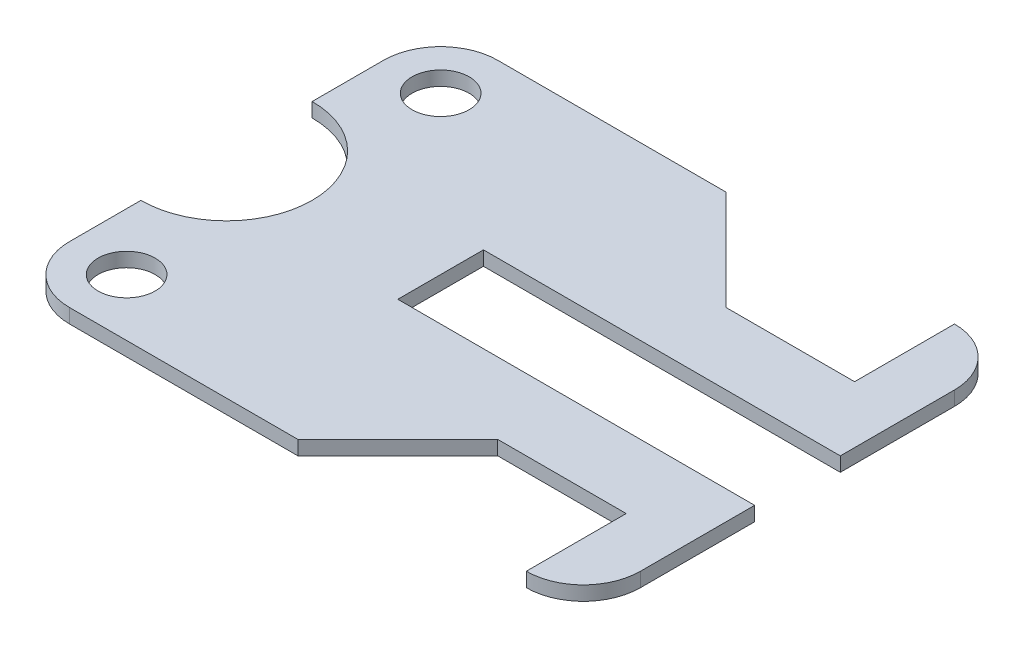
ISO-10303-21;
HEADER;
FILE_DESCRIPTION(('STEP AP214'),'2;1');
FILE_NAME('part.step','',(''),(''),'','','');
FILE_SCHEMA(('AUTOMOTIVE_DESIGN { 1 0 10303 214 1 1 1 1 }'));
ENDSEC;
DATA;
#1=APPLICATION_CONTEXT('core data for automotive mechanical design processes');
#2=APPLICATION_PROTOCOL_DEFINITION('international standard','automotive_design',2000,#1);
#3=PRODUCT_CONTEXT('',#1,'mechanical');
#4=PRODUCT('Part','Part','',(#3));
#5=PRODUCT_RELATED_PRODUCT_CATEGORY('part','',(#4));
#6=PRODUCT_DEFINITION_FORMATION('','',#4);
#7=PRODUCT_DEFINITION_CONTEXT('part definition',#1,'design');
#8=PRODUCT_DEFINITION('design','',#6,#7);
#9=PRODUCT_DEFINITION_SHAPE('','',#8);
#10=(LENGTH_UNIT() NAMED_UNIT(*) SI_UNIT(.MILLI.,.METRE.));
#11=(NAMED_UNIT(*) PLANE_ANGLE_UNIT() SI_UNIT($,.RADIAN.));
#12=(NAMED_UNIT(*) SI_UNIT($,.STERADIAN.) SOLID_ANGLE_UNIT());
#13=UNCERTAINTY_MEASURE_WITH_UNIT(LENGTH_MEASURE(1.E-05),#10,'distance_accuracy_value','');
#14=(GEOMETRIC_REPRESENTATION_CONTEXT(3) GLOBAL_UNCERTAINTY_ASSIGNED_CONTEXT((#13)) GLOBAL_UNIT_ASSIGNED_CONTEXT((#10,
#11,#12)) REPRESENTATION_CONTEXT('',''));
#15=CARTESIAN_POINT('',(0.,0.,0.));
#16=DIRECTION('',(0.,0.,1.));
#17=DIRECTION('',(1.,0.,0.));
#18=AXIS2_PLACEMENT_3D('',#15,#16,#17);
#19=CARTESIAN_POINT('',(16.,1.,11.));
#20=DIRECTION('',(0.,1.,0.));
#21=DIRECTION('',(0.,0.,1.));
#22=AXIS2_PLACEMENT_3D('',#19,#20,#21);
#23=PLANE('',#22);
#24=CARTESIAN_POINT('',(-16.,1.,11.));
#25=DIRECTION('',(0.,1.,0.));
#26=DIRECTION('',(0.,0.,1.));
#27=AXIS2_PLACEMENT_3D('',#24,#25,#26);
#28=CIRCLE('',#27,2.);
#29=CARTESIAN_POINT('',(-16.,1.,13.));
#30=VERTEX_POINT('',#29);
#31=EDGE_CURVE('E208',#30,#30,#28,.T.);
#32=ORIENTED_EDGE('',*,*,#31,.F.);
#33=EDGE_LOOP('',(#32));
#34=FACE_BOUND('',#33,.T.);
#35=CARTESIAN_POINT('',(16.,1.,11.));
#36=DIRECTION('',(0.,1.,0.));
#37=DIRECTION('',(0.,0.,1.));
#38=AXIS2_PLACEMENT_3D('',#35,#36,#37);
#39=CIRCLE('',#38,4.);
#40=CARTESIAN_POINT('',(16.,1.,15.));
#41=VERTEX_POINT('',#40);
#42=CARTESIAN_POINT('',(20.,1.,11.));
#43=VERTEX_POINT('',#42);
#44=EDGE_CURVE('E243',#41,#43,#39,.T.);
#45=ORIENTED_EDGE('',*,*,#44,.T.);
#46=DIRECTION('',(0.,0.,-1.));
#47=VECTOR('',#46,1.);
#48=CARTESIAN_POINT('',(20.,1.,11.));
#49=LINE('',#48,#47);
#50=CARTESIAN_POINT('',(20.,1.,3.));
#51=VERTEX_POINT('',#50);
#52=EDGE_CURVE('E131',#43,#51,#49,.T.);
#53=ORIENTED_EDGE('',*,*,#52,.T.);
#54=DIRECTION('',(-1.,0.,0.));
#55=VECTOR('',#54,1.);
#56=CARTESIAN_POINT('',(20.,1.,3.));
#57=LINE('',#56,#55);
#58=CARTESIAN_POINT('',(-5.,1.,3.));
#59=VERTEX_POINT('',#58);
#60=EDGE_CURVE('E294',#51,#59,#57,.T.);
#61=ORIENTED_EDGE('',*,*,#60,.T.);
#62=DIRECTION('',(0.,0.,-1.));
#63=VECTOR('',#62,1.);
#64=CARTESIAN_POINT('',(-5.,1.,-3.));
#65=LINE('',#64,#63);
#66=CARTESIAN_POINT('',(-5.,1.,-3.));
#67=VERTEX_POINT('',#66);
#68=EDGE_CURVE('E313',#59,#67,#65,.T.);
#69=ORIENTED_EDGE('',*,*,#68,.T.);
#70=DIRECTION('',(1.,0.,0.));
#71=VECTOR('',#70,1.);
#72=CARTESIAN_POINT('',(20.,1.,-3.));
#73=LINE('',#72,#71);
#74=CARTESIAN_POINT('',(20.,1.,-3.));
#75=VERTEX_POINT('',#74);
#76=EDGE_CURVE('E310',#67,#75,#73,.T.);
#77=ORIENTED_EDGE('',*,*,#76,.T.);
#78=DIRECTION('',(0.,0.,-1.));
#79=VECTOR('',#78,1.);
#80=CARTESIAN_POINT('',(20.,1.,-3.));
#81=LINE('',#80,#79);
#82=CARTESIAN_POINT('',(20.,1.,-11.));
#83=VERTEX_POINT('',#82);
#84=EDGE_CURVE('E312',#75,#83,#81,.T.);
#85=ORIENTED_EDGE('',*,*,#84,.T.);
#86=CARTESIAN_POINT('',(16.,1.,-11.));
#87=DIRECTION('',(0.,1.,0.));
#88=DIRECTION('',(0.,0.,-1.));
#89=AXIS2_PLACEMENT_3D('',#86,#87,#88);
#90=CIRCLE('',#89,4.);
#91=CARTESIAN_POINT('',(16.,1.,-15.));
#92=VERTEX_POINT('',#91);
#93=EDGE_CURVE('E315',#83,#92,#90,.T.);
#94=ORIENTED_EDGE('',*,*,#93,.T.);
#95=DIRECTION('',(0.,0.,1.));
#96=VECTOR('',#95,1.);
#97=CARTESIAN_POINT('',(16.,1.,-8.));
#98=LINE('',#97,#96);
#99=CARTESIAN_POINT('',(16.,1.,-8.));
#100=VERTEX_POINT('',#99);
#101=EDGE_CURVE('E321',#92,#100,#98,.T.);
#102=ORIENTED_EDGE('',*,*,#101,.T.);
#103=DIRECTION('',(-1.,0.,0.));
#104=VECTOR('',#103,1.);
#105=CARTESIAN_POINT('',(6.99999999999998,1.,-8.));
#106=LINE('',#105,#104);
#107=CARTESIAN_POINT('',(6.99999999999998,1.,-8.));
#108=VERTEX_POINT('',#107);
#109=EDGE_CURVE('E323',#100,#108,#106,.T.);
#110=ORIENTED_EDGE('',*,*,#109,.T.);
#111=DIRECTION('',(-0.707106781186546,0.,-0.707106781186549));
#112=VECTOR('',#111,1.);
#113=CARTESIAN_POINT('',(0.,1.,-15.));
#114=LINE('',#113,#112);
#115=CARTESIAN_POINT('',(0.,1.,-15.));
#116=VERTEX_POINT('',#115);
#117=EDGE_CURVE('E325',#108,#116,#114,.T.);
#118=ORIENTED_EDGE('',*,*,#117,.T.);
#119=DIRECTION('',(-1.,0.,0.));
#120=VECTOR('',#119,1.);
#121=CARTESIAN_POINT('',(-16.,1.,-15.));
#122=LINE('',#121,#120);
#123=CARTESIAN_POINT('',(-16.,1.,-15.));
#124=VERTEX_POINT('',#123);
#125=EDGE_CURVE('E327',#116,#124,#122,.T.);
#126=ORIENTED_EDGE('',*,*,#125,.T.);
#127=CARTESIAN_POINT('',(-16.,1.,-11.));
#128=DIRECTION('',(0.,1.,0.));
#129=DIRECTION('',(0.,0.,-1.));
#130=AXIS2_PLACEMENT_3D('',#127,#128,#129);
#131=CIRCLE('',#130,4.);
#132=CARTESIAN_POINT('',(-20.,1.,-11.));
#133=VERTEX_POINT('',#132);
#134=EDGE_CURVE('E329',#124,#133,#131,.T.);
#135=ORIENTED_EDGE('',*,*,#134,.T.);
#136=DIRECTION('',(0.,0.,1.));
#137=VECTOR('',#136,1.);
#138=CARTESIAN_POINT('',(-20.,1.,-6.));
#139=LINE('',#138,#137);
#140=CARTESIAN_POINT('',(-20.,1.,-6.));
#141=VERTEX_POINT('',#140);
#142=EDGE_CURVE('E331',#133,#141,#139,.T.);
#143=ORIENTED_EDGE('',*,*,#142,.T.);
#144=CARTESIAN_POINT('',(-20.,1.,0.));
#145=DIRECTION('',(0.,-1.,0.));
#146=DIRECTION('',(0.,0.,1.));
#147=AXIS2_PLACEMENT_3D('',#144,#145,#146);
#148=CIRCLE('',#147,6.);
#149=CARTESIAN_POINT('',(-20.,1.,6.));
#150=VERTEX_POINT('',#149);
#151=EDGE_CURVE('E333',#141,#150,#148,.T.);
#152=ORIENTED_EDGE('',*,*,#151,.T.);
#153=DIRECTION('',(0.,0.,1.));
#154=VECTOR('',#153,1.);
#155=CARTESIAN_POINT('',(-20.,1.,11.));
#156=LINE('',#155,#154);
#157=CARTESIAN_POINT('',(-20.,1.,11.));
#158=VERTEX_POINT('',#157);
#159=EDGE_CURVE('E335',#150,#158,#156,.T.);
#160=ORIENTED_EDGE('',*,*,#159,.T.);
#161=CARTESIAN_POINT('',(-16.,1.,11.));
#162=DIRECTION('',(0.,1.,0.));
#163=DIRECTION('',(0.,0.,-1.));
#164=AXIS2_PLACEMENT_3D('',#161,#162,#163);
#165=CIRCLE('',#164,4.);
#166=CARTESIAN_POINT('',(-16.,1.,15.));
#167=VERTEX_POINT('',#166);
#168=EDGE_CURVE('E337',#158,#167,#165,.T.);
#169=ORIENTED_EDGE('',*,*,#168,.T.);
#170=DIRECTION('',(1.,0.,0.));
#171=VECTOR('',#170,1.);
#172=CARTESIAN_POINT('',(-16.,1.,15.));
#173=LINE('',#172,#171);
#174=CARTESIAN_POINT('',(0.,1.,15.));
#175=VERTEX_POINT('',#174);
#176=EDGE_CURVE('E186',#167,#175,#173,.T.);
#177=ORIENTED_EDGE('',*,*,#176,.T.);
#178=DIRECTION('',(0.707106781186546,0.,-0.707106781186549));
#179=VECTOR('',#178,1.);
#180=CARTESIAN_POINT('',(0.,1.,15.));
#181=LINE('',#180,#179);
#182=CARTESIAN_POINT('',(6.99999999999996,1.,8.));
#183=VERTEX_POINT('',#182);
#184=EDGE_CURVE('E180',#175,#183,#181,.T.);
#185=ORIENTED_EDGE('',*,*,#184,.T.);
#186=DIRECTION('',(1.,0.,0.));
#187=VECTOR('',#186,1.);
#188=CARTESIAN_POINT('',(6.99999999999996,1.,8.));
#189=LINE('',#188,#187);
#190=CARTESIAN_POINT('',(16.,1.,8.));
#191=VERTEX_POINT('',#190);
#192=EDGE_CURVE('E184',#183,#191,#189,.T.);
#193=ORIENTED_EDGE('',*,*,#192,.T.);
#194=DIRECTION('',(0.,0.,1.));
#195=VECTOR('',#194,1.);
#196=CARTESIAN_POINT('',(16.,1.,8.));
#197=LINE('',#196,#195);
#198=EDGE_CURVE('E52',#191,#41,#197,.T.);
#199=ORIENTED_EDGE('',*,*,#198,.T.);
#200=EDGE_LOOP('',(#45,#53,#61,#69,#77,#85,#94,#102,#110,#118,#126,#135,#143,#152,#160,#169,
#177,#185,#193,#199));
#201=FACE_BOUND('',#200,.T.);
#202=CARTESIAN_POINT('',(-16.,1.,-11.));
#203=DIRECTION('',(0.,1.,0.));
#204=DIRECTION('',(0.,0.,1.));
#205=AXIS2_PLACEMENT_3D('',#202,#203,#204);
#206=CIRCLE('',#205,2.);
#207=CARTESIAN_POINT('',(-16.,1.,-9.));
#208=VERTEX_POINT('',#207);
#209=EDGE_CURVE('E379',#208,#208,#206,.T.);
#210=ORIENTED_EDGE('',*,*,#209,.F.);
#211=EDGE_LOOP('',(#210));
#212=FACE_BOUND('',#211,.T.);
#213=ADVANCED_FACE('F35',(#34,#201,#212),#23,.T.);
#214=CARTESIAN_POINT('',(16.,0.,11.));
#215=DIRECTION('',(0.,1.,0.));
#216=DIRECTION('',(0.,0.,1.));
#217=AXIS2_PLACEMENT_3D('',#214,#215,#216);
#218=PLANE('',#217);
#219=CARTESIAN_POINT('',(16.,0.,11.));
#220=DIRECTION('',(0.,1.,0.));
#221=DIRECTION('',(0.,0.,1.));
#222=AXIS2_PLACEMENT_3D('',#219,#220,#221);
#223=CIRCLE('',#222,4.);
#224=CARTESIAN_POINT('',(16.,0.,15.));
#225=VERTEX_POINT('',#224);
#226=CARTESIAN_POINT('',(20.,0.,11.));
#227=VERTEX_POINT('',#226);
#228=EDGE_CURVE('E204',#225,#227,#223,.T.);
#229=ORIENTED_EDGE('',*,*,#228,.F.);
#230=DIRECTION('',(0.,0.,1.));
#231=VECTOR('',#230,1.);
#232=CARTESIAN_POINT('',(16.,0.,8.));
#233=LINE('',#232,#231);
#234=CARTESIAN_POINT('',(16.,0.,8.));
#235=VERTEX_POINT('',#234);
#236=EDGE_CURVE('E123',#235,#225,#233,.T.);
#237=ORIENTED_EDGE('',*,*,#236,.F.);
#238=DIRECTION('',(1.,0.,0.));
#239=VECTOR('',#238,1.);
#240=CARTESIAN_POINT('',(6.99999999999996,0.,8.));
#241=LINE('',#240,#239);
#242=CARTESIAN_POINT('',(6.99999999999996,0.,8.));
#243=VERTEX_POINT('',#242);
#244=EDGE_CURVE('E117',#243,#235,#241,.T.);
#245=ORIENTED_EDGE('',*,*,#244,.F.);
#246=DIRECTION('',(0.707106781186546,0.,-0.707106781186549));
#247=VECTOR('',#246,1.);
#248=CARTESIAN_POINT('',(0.,0.,15.));
#249=LINE('',#248,#247);
#250=CARTESIAN_POINT('',(0.,0.,15.));
#251=VERTEX_POINT('',#250);
#252=EDGE_CURVE('E194',#251,#243,#249,.T.);
#253=ORIENTED_EDGE('',*,*,#252,.F.);
#254=DIRECTION('',(1.,0.,0.));
#255=VECTOR('',#254,1.);
#256=CARTESIAN_POINT('',(-16.,0.,15.));
#257=LINE('',#256,#255);
#258=CARTESIAN_POINT('',(-16.,0.,15.));
#259=VERTEX_POINT('',#258);
#260=EDGE_CURVE('E238',#259,#251,#257,.T.);
#261=ORIENTED_EDGE('',*,*,#260,.F.);
#262=CARTESIAN_POINT('',(-16.,0.,11.));
#263=DIRECTION('',(0.,1.,0.));
#264=DIRECTION('',(0.,0.,-1.));
#265=AXIS2_PLACEMENT_3D('',#262,#263,#264);
#266=CIRCLE('',#265,4.);
#267=CARTESIAN_POINT('',(-20.,0.,11.));
#268=VERTEX_POINT('',#267);
#269=EDGE_CURVE('E236',#268,#259,#266,.T.);
#270=ORIENTED_EDGE('',*,*,#269,.F.);
#271=DIRECTION('',(0.,0.,1.));
#272=VECTOR('',#271,1.);
#273=CARTESIAN_POINT('',(-20.,0.,11.));
#274=LINE('',#273,#272);
#275=CARTESIAN_POINT('',(-20.,0.,6.));
#276=VERTEX_POINT('',#275);
#277=EDGE_CURVE('E234',#276,#268,#274,.T.);
#278=ORIENTED_EDGE('',*,*,#277,.F.);
#279=CARTESIAN_POINT('',(-20.,0.,0.));
#280=DIRECTION('',(0.,-1.,0.));
#281=DIRECTION('',(0.,0.,1.));
#282=AXIS2_PLACEMENT_3D('',#279,#280,#281);
#283=CIRCLE('',#282,6.);
#284=CARTESIAN_POINT('',(-20.,0.,-6.));
#285=VERTEX_POINT('',#284);
#286=EDGE_CURVE('E232',#285,#276,#283,.T.);
#287=ORIENTED_EDGE('',*,*,#286,.F.);
#288=DIRECTION('',(0.,0.,1.));
#289=VECTOR('',#288,1.);
#290=CARTESIAN_POINT('',(-20.,0.,-6.));
#291=LINE('',#290,#289);
#292=CARTESIAN_POINT('',(-20.,0.,-11.));
#293=VERTEX_POINT('',#292);
#294=EDGE_CURVE('E230',#293,#285,#291,.T.);
#295=ORIENTED_EDGE('',*,*,#294,.F.);
#296=CARTESIAN_POINT('',(-16.,0.,-11.));
#297=DIRECTION('',(0.,1.,0.));
#298=DIRECTION('',(0.,0.,-1.));
#299=AXIS2_PLACEMENT_3D('',#296,#297,#298);
#300=CIRCLE('',#299,4.);
#301=CARTESIAN_POINT('',(-16.,0.,-15.));
#302=VERTEX_POINT('',#301);
#303=EDGE_CURVE('E228',#302,#293,#300,.T.);
#304=ORIENTED_EDGE('',*,*,#303,.F.);
#305=DIRECTION('',(-1.,0.,0.));
#306=VECTOR('',#305,1.);
#307=CARTESIAN_POINT('',(-16.,0.,-15.));
#308=LINE('',#307,#306);
#309=CARTESIAN_POINT('',(0.,0.,-15.));
#310=VERTEX_POINT('',#309);
#311=EDGE_CURVE('E226',#310,#302,#308,.T.);
#312=ORIENTED_EDGE('',*,*,#311,.F.);
#313=DIRECTION('',(-0.707106781186546,0.,-0.707106781186549));
#314=VECTOR('',#313,1.);
#315=CARTESIAN_POINT('',(0.,0.,-15.));
#316=LINE('',#315,#314);
#317=CARTESIAN_POINT('',(6.99999999999998,0.,-8.));
#318=VERTEX_POINT('',#317);
#319=EDGE_CURVE('E224',#318,#310,#316,.T.);
#320=ORIENTED_EDGE('',*,*,#319,.F.);
#321=DIRECTION('',(-1.,0.,0.));
#322=VECTOR('',#321,1.);
#323=CARTESIAN_POINT('',(6.99999999999998,0.,-8.));
#324=LINE('',#323,#322);
#325=CARTESIAN_POINT('',(16.,0.,-8.));
#326=VERTEX_POINT('',#325);
#327=EDGE_CURVE('E222',#326,#318,#324,.T.);
#328=ORIENTED_EDGE('',*,*,#327,.F.);
#329=DIRECTION('',(0.,0.,1.));
#330=VECTOR('',#329,1.);
#331=CARTESIAN_POINT('',(16.,0.,-8.));
#332=LINE('',#331,#330);
#333=CARTESIAN_POINT('',(16.,0.,-15.));
#334=VERTEX_POINT('',#333);
#335=EDGE_CURVE('E220',#334,#326,#332,.T.);
#336=ORIENTED_EDGE('',*,*,#335,.F.);
#337=CARTESIAN_POINT('',(16.,0.,-11.));
#338=DIRECTION('',(0.,1.,0.));
#339=DIRECTION('',(0.,0.,-1.));
#340=AXIS2_PLACEMENT_3D('',#337,#338,#339);
#341=CIRCLE('',#340,4.);
#342=CARTESIAN_POINT('',(20.,0.,-11.));
#343=VERTEX_POINT('',#342);
#344=EDGE_CURVE('E218',#343,#334,#341,.T.);
#345=ORIENTED_EDGE('',*,*,#344,.F.);
#346=DIRECTION('',(0.,0.,-1.));
#347=VECTOR('',#346,1.);
#348=CARTESIAN_POINT('',(20.,0.,-3.));
#349=LINE('',#348,#347);
#350=CARTESIAN_POINT('',(20.,0.,-3.));
#351=VERTEX_POINT('',#350);
#352=EDGE_CURVE('E216',#351,#343,#349,.T.);
#353=ORIENTED_EDGE('',*,*,#352,.F.);
#354=DIRECTION('',(1.,0.,0.));
#355=VECTOR('',#354,1.);
#356=CARTESIAN_POINT('',(20.,0.,-3.));
#357=LINE('',#356,#355);
#358=CARTESIAN_POINT('',(-5.,0.,-3.));
#359=VERTEX_POINT('',#358);
#360=EDGE_CURVE('E214',#359,#351,#357,.T.);
#361=ORIENTED_EDGE('',*,*,#360,.F.);
#362=DIRECTION('',(0.,0.,-1.));
#363=VECTOR('',#362,1.);
#364=CARTESIAN_POINT('',(-5.,0.,-3.));
#365=LINE('',#364,#363);
#366=CARTESIAN_POINT('',(-5.,0.,3.));
#367=VERTEX_POINT('',#366);
#368=EDGE_CURVE('E212',#367,#359,#365,.T.);
#369=ORIENTED_EDGE('',*,*,#368,.F.);
#370=DIRECTION('',(-1.,0.,0.));
#371=VECTOR('',#370,1.);
#372=CARTESIAN_POINT('',(20.,0.,3.));
#373=LINE('',#372,#371);
#374=CARTESIAN_POINT('',(20.,0.,3.));
#375=VERTEX_POINT('',#374);
#376=EDGE_CURVE('E210',#375,#367,#373,.T.);
#377=ORIENTED_EDGE('',*,*,#376,.F.);
#378=DIRECTION('',(0.,0.,-1.));
#379=VECTOR('',#378,1.);
#380=CARTESIAN_POINT('',(20.,0.,11.));
#381=LINE('',#380,#379);
#382=EDGE_CURVE('E207',#227,#375,#381,.T.);
#383=ORIENTED_EDGE('',*,*,#382,.F.);
#384=EDGE_LOOP('',(#229,#237,#245,#253,#261,#270,#278,#287,#295,#304,#312,#320,#328,#336,#345,
#353,#361,#369,#377,#383));
#385=FACE_BOUND('',#384,.T.);
#386=CARTESIAN_POINT('',(-16.,0.,11.));
#387=DIRECTION('',(0.,1.,0.));
#388=DIRECTION('',(0.,0.,1.));
#389=AXIS2_PLACEMENT_3D('',#386,#387,#388);
#390=CIRCLE('',#389,2.);
#391=CARTESIAN_POINT('',(-16.,0.,13.));
#392=VERTEX_POINT('',#391);
#393=EDGE_CURVE('E385',#392,#392,#390,.T.);
#394=ORIENTED_EDGE('',*,*,#393,.T.);
#395=EDGE_LOOP('',(#394));
#396=FACE_BOUND('',#395,.T.);
#397=CARTESIAN_POINT('',(-16.,0.,-11.));
#398=DIRECTION('',(0.,1.,0.));
#399=DIRECTION('',(0.,0.,1.));
#400=AXIS2_PLACEMENT_3D('',#397,#398,#399);
#401=CIRCLE('',#400,2.);
#402=CARTESIAN_POINT('',(-16.,0.,-9.));
#403=VERTEX_POINT('',#402);
#404=EDGE_CURVE('E382',#403,#403,#401,.T.);
#405=ORIENTED_EDGE('',*,*,#404,.T.);
#406=EDGE_LOOP('',(#405));
#407=FACE_BOUND('',#406,.T.);
#408=ADVANCED_FACE('F298',(#385,#396,#407),#218,.F.);
#409=CARTESIAN_POINT('',(16.,1.,11.));
#410=DIRECTION('',(0.,-1.,0.));
#411=DIRECTION('',(0.,0.,-1.));
#412=AXIS2_PLACEMENT_3D('',#409,#410,#411);
#413=CYLINDRICAL_SURFACE('',#412,4.);
#414=ORIENTED_EDGE('',*,*,#228,.T.);
#415=DIRECTION('',(0.,-1.,0.));
#416=VECTOR('',#415,1.);
#417=CARTESIAN_POINT('',(20.,1.,11.));
#418=LINE('',#417,#416);
#419=EDGE_CURVE('E11',#43,#227,#418,.T.);
#420=ORIENTED_EDGE('',*,*,#419,.F.);
#421=ORIENTED_EDGE('',*,*,#44,.F.);
#422=DIRECTION('',(0.,-1.,0.));
#423=VECTOR('',#422,1.);
#424=CARTESIAN_POINT('',(16.,1.,15.));
#425=LINE('',#424,#423);
#426=EDGE_CURVE('E200',#41,#225,#425,.T.);
#427=ORIENTED_EDGE('',*,*,#426,.T.);
#428=EDGE_LOOP('',(#414,#420,#421,#427));
#429=FACE_BOUND('',#428,.T.);
#430=ADVANCED_FACE('F37',(#429),#413,.T.);
#431=CARTESIAN_POINT('',(20.,1.,11.));
#432=DIRECTION('',(-1.,0.,0.));
#433=DIRECTION('',(0.,0.,1.));
#434=AXIS2_PLACEMENT_3D('',#431,#432,#433);
#435=PLANE('',#434);
#436=ORIENTED_EDGE('',*,*,#382,.T.);
#437=DIRECTION('',(0.,-1.,0.));
#438=VECTOR('',#437,1.);
#439=CARTESIAN_POINT('',(20.,1.,3.));
#440=LINE('',#439,#438);
#441=EDGE_CURVE('E44',#51,#375,#440,.T.);
#442=ORIENTED_EDGE('',*,*,#441,.F.);
#443=ORIENTED_EDGE('',*,*,#52,.F.);
#444=ORIENTED_EDGE('',*,*,#419,.T.);
#445=EDGE_LOOP('',(#436,#442,#443,#444));
#446=FACE_BOUND('',#445,.T.);
#447=ADVANCED_FACE('F558',(#446),#435,.F.);
#448=CARTESIAN_POINT('',(20.,1.,3.));
#449=DIRECTION('',(0.,0.,1.));
#450=DIRECTION('',(1.,0.,0.));
#451=AXIS2_PLACEMENT_3D('',#448,#449,#450);
#452=PLANE('',#451);
#453=ORIENTED_EDGE('',*,*,#376,.T.);
#454=DIRECTION('',(0.,-1.,0.));
#455=VECTOR('',#454,1.);
#456=CARTESIAN_POINT('',(-5.,1.,3.));
#457=LINE('',#456,#455);
#458=EDGE_CURVE('E286',#59,#367,#457,.T.);
#459=ORIENTED_EDGE('',*,*,#458,.F.);
#460=ORIENTED_EDGE('',*,*,#60,.F.);
#461=ORIENTED_EDGE('',*,*,#441,.T.);
#462=EDGE_LOOP('',(#453,#459,#460,#461));
#463=FACE_BOUND('',#462,.T.);
#464=ADVANCED_FACE('F292',(#463),#452,.F.);
#465=CARTESIAN_POINT('',(-5.,1.,-3.));
#466=DIRECTION('',(-1.,0.,0.));
#467=DIRECTION('',(0.,0.,1.));
#468=AXIS2_PLACEMENT_3D('',#465,#466,#467);
#469=PLANE('',#468);
#470=ORIENTED_EDGE('',*,*,#368,.T.);
#471=DIRECTION('',(0.,-1.,0.));
#472=VECTOR('',#471,1.);
#473=CARTESIAN_POINT('',(-5.,1.,-3.));
#474=LINE('',#473,#472);
#475=EDGE_CURVE('E283',#67,#359,#474,.T.);
#476=ORIENTED_EDGE('',*,*,#475,.F.);
#477=ORIENTED_EDGE('',*,*,#68,.F.);
#478=ORIENTED_EDGE('',*,*,#458,.T.);
#479=EDGE_LOOP('',(#470,#476,#477,#478));
#480=FACE_BOUND('',#479,.T.);
#481=ADVANCED_FACE('F304',(#480),#469,.F.);
#482=CARTESIAN_POINT('',(20.,1.,-3.));
#483=DIRECTION('',(0.,0.,-1.));
#484=DIRECTION('',(-1.,0.,0.));
#485=AXIS2_PLACEMENT_3D('',#482,#483,#484);
#486=PLANE('',#485);
#487=ORIENTED_EDGE('',*,*,#360,.T.);
#488=DIRECTION('',(0.,-1.,0.));
#489=VECTOR('',#488,1.);
#490=CARTESIAN_POINT('',(20.,1.,-3.));
#491=LINE('',#490,#489);
#492=EDGE_CURVE('E280',#75,#351,#491,.T.);
#493=ORIENTED_EDGE('',*,*,#492,.F.);
#494=ORIENTED_EDGE('',*,*,#76,.F.);
#495=ORIENTED_EDGE('',*,*,#475,.T.);
#496=EDGE_LOOP('',(#487,#493,#494,#495));
#497=FACE_BOUND('',#496,.T.);
#498=ADVANCED_FACE('F308',(#497),#486,.F.);
#499=CARTESIAN_POINT('',(20.,1.,-3.));
#500=DIRECTION('',(-1.,0.,0.));
#501=DIRECTION('',(0.,0.,1.));
#502=AXIS2_PLACEMENT_3D('',#499,#500,#501);
#503=PLANE('',#502);
#504=ORIENTED_EDGE('',*,*,#352,.T.);
#505=DIRECTION('',(0.,-1.,0.));
#506=VECTOR('',#505,1.);
#507=CARTESIAN_POINT('',(20.,1.,-11.));
#508=LINE('',#507,#506);
#509=EDGE_CURVE('E277',#83,#343,#508,.T.);
#510=ORIENTED_EDGE('',*,*,#509,.F.);
#511=ORIENTED_EDGE('',*,*,#84,.F.);
#512=ORIENTED_EDGE('',*,*,#492,.T.);
#513=EDGE_LOOP('',(#504,#510,#511,#512));
#514=FACE_BOUND('',#513,.T.);
#515=ADVANCED_FACE('F523',(#514),#503,.F.);
#516=CARTESIAN_POINT('',(16.,1.,-11.));
#517=DIRECTION('',(0.,-1.,0.));
#518=DIRECTION('',(0.,0.,-1.));
#519=AXIS2_PLACEMENT_3D('',#516,#517,#518);
#520=CYLINDRICAL_SURFACE('',#519,4.);
#521=ORIENTED_EDGE('',*,*,#344,.T.);
#522=DIRECTION('',(0.,-1.,0.));
#523=VECTOR('',#522,1.);
#524=CARTESIAN_POINT('',(16.,1.,-15.));
#525=LINE('',#524,#523);
#526=EDGE_CURVE('E274',#92,#334,#525,.T.);
#527=ORIENTED_EDGE('',*,*,#526,.F.);
#528=ORIENTED_EDGE('',*,*,#93,.F.);
#529=ORIENTED_EDGE('',*,*,#509,.T.);
#530=EDGE_LOOP('',(#521,#527,#528,#529));
#531=FACE_BOUND('',#530,.T.);
#532=ADVANCED_FACE('F513',(#531),#520,.T.);
#533=CARTESIAN_POINT('',(16.,1.,-8.));
#534=DIRECTION('',(1.,0.,0.));
#535=DIRECTION('',(0.,0.,-1.));
#536=AXIS2_PLACEMENT_3D('',#533,#534,#535);
#537=PLANE('',#536);
#538=ORIENTED_EDGE('',*,*,#335,.T.);
#539=DIRECTION('',(0.,-1.,0.));
#540=VECTOR('',#539,1.);
#541=CARTESIAN_POINT('',(16.,1.,-8.));
#542=LINE('',#541,#540);
#543=EDGE_CURVE('E271',#100,#326,#542,.T.);
#544=ORIENTED_EDGE('',*,*,#543,.F.);
#545=ORIENTED_EDGE('',*,*,#101,.F.);
#546=ORIENTED_EDGE('',*,*,#526,.T.);
#547=EDGE_LOOP('',(#538,#544,#545,#546));
#548=FACE_BOUND('',#547,.T.);
#549=ADVANCED_FACE('F503',(#548),#537,.F.);
#550=CARTESIAN_POINT('',(6.99999999999998,1.,-8.));
#551=DIRECTION('',(0.,0.,1.));
#552=DIRECTION('',(1.,0.,0.));
#553=AXIS2_PLACEMENT_3D('',#550,#551,#552);
#554=PLANE('',#553);
#555=ORIENTED_EDGE('',*,*,#327,.T.);
#556=DIRECTION('',(0.,-1.,0.));
#557=VECTOR('',#556,1.);
#558=CARTESIAN_POINT('',(6.99999999999998,1.,-8.));
#559=LINE('',#558,#557);
#560=EDGE_CURVE('E268',#108,#318,#559,.T.);
#561=ORIENTED_EDGE('',*,*,#560,.F.);
#562=ORIENTED_EDGE('',*,*,#109,.F.);
#563=ORIENTED_EDGE('',*,*,#543,.T.);
#564=EDGE_LOOP('',(#555,#561,#562,#563));
#565=FACE_BOUND('',#564,.T.);
#566=ADVANCED_FACE('F493',(#565),#554,.F.);
#567=CARTESIAN_POINT('',(0.,1.,-15.));
#568=DIRECTION('',(-0.707106781186549,0.,0.707106781186546));
#569=DIRECTION('',(0.707106781186546,0.,0.707106781186549));
#570=AXIS2_PLACEMENT_3D('',#567,#568,#569);
#571=PLANE('',#570);
#572=ORIENTED_EDGE('',*,*,#319,.T.);
#573=DIRECTION('',(0.,-1.,0.));
#574=VECTOR('',#573,1.);
#575=CARTESIAN_POINT('',(0.,1.,-15.));
#576=LINE('',#575,#574);
#577=EDGE_CURVE('E265',#116,#310,#576,.T.);
#578=ORIENTED_EDGE('',*,*,#577,.F.);
#579=ORIENTED_EDGE('',*,*,#117,.F.);
#580=ORIENTED_EDGE('',*,*,#560,.T.);
#581=EDGE_LOOP('',(#572,#578,#579,#580));
#582=FACE_BOUND('',#581,.T.);
#583=ADVANCED_FACE('F483',(#582),#571,.F.);
#584=CARTESIAN_POINT('',(-16.,1.,-15.));
#585=DIRECTION('',(0.,0.,1.));
#586=DIRECTION('',(1.,0.,0.));
#587=AXIS2_PLACEMENT_3D('',#584,#585,#586);
#588=PLANE('',#587);
#589=ORIENTED_EDGE('',*,*,#311,.T.);
#590=DIRECTION('',(0.,-1.,0.));
#591=VECTOR('',#590,1.);
#592=CARTESIAN_POINT('',(-16.,1.,-15.));
#593=LINE('',#592,#591);
#594=EDGE_CURVE('E262',#124,#302,#593,.T.);
#595=ORIENTED_EDGE('',*,*,#594,.F.);
#596=ORIENTED_EDGE('',*,*,#125,.F.);
#597=ORIENTED_EDGE('',*,*,#577,.T.);
#598=EDGE_LOOP('',(#589,#595,#596,#597));
#599=FACE_BOUND('',#598,.T.);
#600=ADVANCED_FACE('F473',(#599),#588,.F.);
#601=CARTESIAN_POINT('',(-16.,1.,-11.));
#602=DIRECTION('',(0.,-1.,0.));
#603=DIRECTION('',(0.,0.,-1.));
#604=AXIS2_PLACEMENT_3D('',#601,#602,#603);
#605=CYLINDRICAL_SURFACE('',#604,4.);
#606=ORIENTED_EDGE('',*,*,#303,.T.);
#607=DIRECTION('',(0.,-1.,0.));
#608=VECTOR('',#607,1.);
#609=CARTESIAN_POINT('',(-20.,1.,-11.));
#610=LINE('',#609,#608);
#611=EDGE_CURVE('E259',#133,#293,#610,.T.);
#612=ORIENTED_EDGE('',*,*,#611,.F.);
#613=ORIENTED_EDGE('',*,*,#134,.F.);
#614=ORIENTED_EDGE('',*,*,#594,.T.);
#615=EDGE_LOOP('',(#606,#612,#613,#614));
#616=FACE_BOUND('',#615,.T.);
#617=ADVANCED_FACE('F463',(#616),#605,.T.);
#618=CARTESIAN_POINT('',(-20.,1.,-6.));
#619=DIRECTION('',(1.,0.,0.));
#620=DIRECTION('',(0.,0.,-1.));
#621=AXIS2_PLACEMENT_3D('',#618,#619,#620);
#622=PLANE('',#621);
#623=ORIENTED_EDGE('',*,*,#294,.T.);
#624=DIRECTION('',(0.,-1.,0.));
#625=VECTOR('',#624,1.);
#626=CARTESIAN_POINT('',(-20.,1.,-6.));
#627=LINE('',#626,#625);
#628=EDGE_CURVE('E256',#141,#285,#627,.T.);
#629=ORIENTED_EDGE('',*,*,#628,.F.);
#630=ORIENTED_EDGE('',*,*,#142,.F.);
#631=ORIENTED_EDGE('',*,*,#611,.T.);
#632=EDGE_LOOP('',(#623,#629,#630,#631));
#633=FACE_BOUND('',#632,.T.);
#634=ADVANCED_FACE('F453',(#633),#622,.F.);
#635=CARTESIAN_POINT('',(-20.,1.,0.));
#636=DIRECTION('',(0.,-1.,0.));
#637=DIRECTION('',(0.,0.,-1.));
#638=AXIS2_PLACEMENT_3D('',#635,#636,#637);
#639=CYLINDRICAL_SURFACE('',#638,6.);
#640=ORIENTED_EDGE('',*,*,#286,.T.);
#641=DIRECTION('',(0.,-1.,0.));
#642=VECTOR('',#641,1.);
#643=CARTESIAN_POINT('',(-20.,1.,6.));
#644=LINE('',#643,#642);
#645=EDGE_CURVE('E253',#150,#276,#644,.T.);
#646=ORIENTED_EDGE('',*,*,#645,.F.);
#647=ORIENTED_EDGE('',*,*,#151,.F.);
#648=ORIENTED_EDGE('',*,*,#628,.T.);
#649=EDGE_LOOP('',(#640,#646,#647,#648));
#650=FACE_BOUND('',#649,.T.);
#651=ADVANCED_FACE('F443',(#650),#639,.F.);
#652=CARTESIAN_POINT('',(-20.,1.,11.));
#653=DIRECTION('',(1.,0.,0.));
#654=DIRECTION('',(0.,0.,-1.));
#655=AXIS2_PLACEMENT_3D('',#652,#653,#654);
#656=PLANE('',#655);
#657=ORIENTED_EDGE('',*,*,#277,.T.);
#658=DIRECTION('',(0.,-1.,0.));
#659=VECTOR('',#658,1.);
#660=CARTESIAN_POINT('',(-20.,1.,11.));
#661=LINE('',#660,#659);
#662=EDGE_CURVE('E250',#158,#268,#661,.T.);
#663=ORIENTED_EDGE('',*,*,#662,.F.);
#664=ORIENTED_EDGE('',*,*,#159,.F.);
#665=ORIENTED_EDGE('',*,*,#645,.T.);
#666=EDGE_LOOP('',(#657,#663,#664,#665));
#667=FACE_BOUND('',#666,.T.);
#668=ADVANCED_FACE('F434',(#667),#656,.F.);
#669=CARTESIAN_POINT('',(-16.,1.,11.));
#670=DIRECTION('',(0.,-1.,0.));
#671=DIRECTION('',(0.,0.,-1.));
#672=AXIS2_PLACEMENT_3D('',#669,#670,#671);
#673=CYLINDRICAL_SURFACE('',#672,4.);
#674=ORIENTED_EDGE('',*,*,#269,.T.);
#675=DIRECTION('',(0.,-1.,0.));
#676=VECTOR('',#675,1.);
#677=CARTESIAN_POINT('',(-16.,1.,15.));
#678=LINE('',#677,#676);
#679=EDGE_CURVE('E247',#167,#259,#678,.T.);
#680=ORIENTED_EDGE('',*,*,#679,.F.);
#681=ORIENTED_EDGE('',*,*,#168,.F.);
#682=ORIENTED_EDGE('',*,*,#662,.T.);
#683=EDGE_LOOP('',(#674,#680,#681,#682));
#684=FACE_BOUND('',#683,.T.);
#685=ADVANCED_FACE('F343',(#684),#673,.T.);
#686=CARTESIAN_POINT('',(-16.,1.,15.));
#687=DIRECTION('',(0.,0.,-1.));
#688=DIRECTION('',(-1.,0.,0.));
#689=AXIS2_PLACEMENT_3D('',#686,#687,#688);
#690=PLANE('',#689);
#691=ORIENTED_EDGE('',*,*,#260,.T.);
#692=DIRECTION('',(0.,-1.,0.));
#693=VECTOR('',#692,1.);
#694=CARTESIAN_POINT('',(0.,1.,15.));
#695=LINE('',#694,#693);
#696=EDGE_CURVE('E195',#175,#251,#695,.T.);
#697=ORIENTED_EDGE('',*,*,#696,.F.);
#698=ORIENTED_EDGE('',*,*,#176,.F.);
#699=ORIENTED_EDGE('',*,*,#679,.T.);
#700=EDGE_LOOP('',(#691,#697,#698,#699));
#701=FACE_BOUND('',#700,.T.);
#702=ADVANCED_FACE('F347',(#701),#690,.F.);
#703=CARTESIAN_POINT('',(0.,1.,15.));
#704=DIRECTION('',(-0.707106781186549,0.,-0.707106781186546));
#705=DIRECTION('',(-0.707106781186546,0.,0.707106781186549));
#706=AXIS2_PLACEMENT_3D('',#703,#704,#705);
#707=PLANE('',#706);
#708=ORIENTED_EDGE('',*,*,#252,.T.);
#709=DIRECTION('',(0.,-1.,0.));
#710=VECTOR('',#709,1.);
#711=CARTESIAN_POINT('',(6.99999999999996,1.,8.));
#712=LINE('',#711,#710);
#713=EDGE_CURVE('E191',#183,#243,#712,.T.);
#714=ORIENTED_EDGE('',*,*,#713,.F.);
#715=ORIENTED_EDGE('',*,*,#184,.F.);
#716=ORIENTED_EDGE('',*,*,#696,.T.);
#717=EDGE_LOOP('',(#708,#714,#715,#716));
#718=FACE_BOUND('',#717,.T.);
#719=ADVANCED_FACE('F192',(#718),#707,.F.);
#720=CARTESIAN_POINT('',(6.99999999999996,1.,8.));
#721=DIRECTION('',(0.,0.,-1.));
#722=DIRECTION('',(-1.,0.,0.));
#723=AXIS2_PLACEMENT_3D('',#720,#721,#722);
#724=PLANE('',#723);
#725=ORIENTED_EDGE('',*,*,#244,.T.);
#726=DIRECTION('',(0.,-1.,0.));
#727=VECTOR('',#726,1.);
#728=CARTESIAN_POINT('',(16.,1.,8.));
#729=LINE('',#728,#727);
#730=EDGE_CURVE('E196',#191,#235,#729,.T.);
#731=ORIENTED_EDGE('',*,*,#730,.F.);
#732=ORIENTED_EDGE('',*,*,#192,.F.);
#733=ORIENTED_EDGE('',*,*,#713,.T.);
#734=EDGE_LOOP('',(#725,#731,#732,#733));
#735=FACE_BOUND('',#734,.T.);
#736=ADVANCED_FACE('F198',(#735),#724,.F.);
#737=CARTESIAN_POINT('',(16.,1.,8.));
#738=DIRECTION('',(1.,0.,0.));
#739=DIRECTION('',(0.,0.,-1.));
#740=AXIS2_PLACEMENT_3D('',#737,#738,#739);
#741=PLANE('',#740);
#742=ORIENTED_EDGE('',*,*,#236,.T.);
#743=ORIENTED_EDGE('',*,*,#426,.F.);
#744=ORIENTED_EDGE('',*,*,#198,.F.);
#745=ORIENTED_EDGE('',*,*,#730,.T.);
#746=EDGE_LOOP('',(#742,#743,#744,#745));
#747=FACE_BOUND('',#746,.T.);
#748=ADVANCED_FACE('F351',(#747),#741,.F.);
#749=CARTESIAN_POINT('',(-16.,1.,11.));
#750=DIRECTION('',(0.,-1.,0.));
#751=DIRECTION('',(0.,0.,-1.));
#752=AXIS2_PLACEMENT_3D('',#749,#750,#751);
#753=CYLINDRICAL_SURFACE('',#752,2.);
#754=ORIENTED_EDGE('',*,*,#31,.T.);
#755=EDGE_LOOP('',(#754));
#756=FACE_BOUND('',#755,.T.);
#757=ORIENTED_EDGE('',*,*,#393,.F.);
#758=EDGE_LOOP('',(#757));
#759=FACE_BOUND('',#758,.T.);
#760=ADVANCED_FACE('F353',(#756,#759),#753,.F.);
#761=CARTESIAN_POINT('',(-16.,1.,-11.));
#762=DIRECTION('',(0.,-1.,0.));
#763=DIRECTION('',(0.,0.,-1.));
#764=AXIS2_PLACEMENT_3D('',#761,#762,#763);
#765=CYLINDRICAL_SURFACE('',#764,2.);
#766=ORIENTED_EDGE('',*,*,#209,.T.);
#767=EDGE_LOOP('',(#766));
#768=FACE_BOUND('',#767,.T.);
#769=ORIENTED_EDGE('',*,*,#404,.F.);
#770=EDGE_LOOP('',(#769));
#771=FACE_BOUND('',#770,.T.);
#772=ADVANCED_FACE('F359',(#768,#771),#765,.F.);
#773=CLOSED_SHELL('',(#213,#408,#430,#447,#464,#481,#498,#515,#532,#549,#566,#583,#600,#617,
#634,#651,#668,#685,#702,#719,#736,#748,#760,#772));
#774=MANIFOLD_SOLID_BREP('B2',#773);
#775=ADVANCED_BREP_SHAPE_REPRESENTATION('',(#18,#774),#14);
#776=SHAPE_DEFINITION_REPRESENTATION(#9,#775);
ENDSEC;
END-ISO-10303-21;
